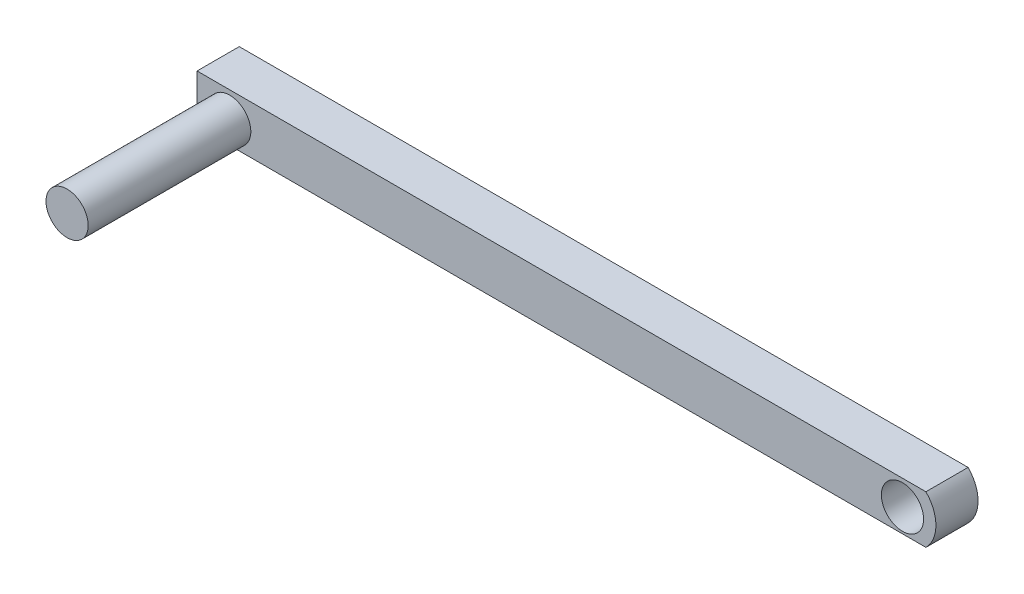
ISO-10303-21;
HEADER;
FILE_DESCRIPTION(('STEP AP214'),'2;1');
FILE_NAME('part.step','',(''),(''),'','','');
FILE_SCHEMA(('AUTOMOTIVE_DESIGN { 1 0 10303 214 1 1 1 1 }'));
ENDSEC;
DATA;
#1=APPLICATION_CONTEXT('core data for automotive mechanical design processes');
#2=APPLICATION_PROTOCOL_DEFINITION('international standard','automotive_design',2000,#1);
#3=PRODUCT_CONTEXT('',#1,'mechanical');
#4=PRODUCT('Part','Part','',(#3));
#5=PRODUCT_RELATED_PRODUCT_CATEGORY('part','',(#4));
#6=PRODUCT_DEFINITION_FORMATION('','',#4);
#7=PRODUCT_DEFINITION_CONTEXT('part definition',#1,'design');
#8=PRODUCT_DEFINITION('design','',#6,#7);
#9=PRODUCT_DEFINITION_SHAPE('','',#8);
#10=(LENGTH_UNIT() NAMED_UNIT(*) SI_UNIT(.MILLI.,.METRE.));
#11=(NAMED_UNIT(*) PLANE_ANGLE_UNIT() SI_UNIT($,.RADIAN.));
#12=(NAMED_UNIT(*) SI_UNIT($,.STERADIAN.) SOLID_ANGLE_UNIT());
#13=UNCERTAINTY_MEASURE_WITH_UNIT(LENGTH_MEASURE(1.E-05),#10,'distance_accuracy_value','');
#14=(GEOMETRIC_REPRESENTATION_CONTEXT(3) GLOBAL_UNCERTAINTY_ASSIGNED_CONTEXT((#13)) GLOBAL_UNIT_ASSIGNED_CONTEXT((#10,
#11,#12)) REPRESENTATION_CONTEXT('',''));
#15=CARTESIAN_POINT('',(0.,0.,0.));
#16=DIRECTION('',(0.,0.,1.));
#17=DIRECTION('',(1.,0.,0.));
#18=AXIS2_PLACEMENT_3D('',#15,#16,#17);
#19=CARTESIAN_POINT('',(-107.371794871795,35.7905982905983,14.));
#20=DIRECTION('',(1.,0.,0.));
#21=DIRECTION('',(0.,0.,-1.));
#22=AXIS2_PLACEMENT_3D('',#19,#20,#21);
#23=PLANE('',#22);
#24=DIRECTION('',(0.,-1.,0.));
#25=VECTOR('',#24,1.);
#26=CARTESIAN_POINT('',(-107.371794871795,35.7905982905983,0.));
#27=LINE('',#26,#25);
#28=CARTESIAN_POINT('',(-107.371794871795,35.7905982905983,0.));
#29=VERTEX_POINT('',#28);
#30=CARTESIAN_POINT('',(-107.371794871795,19.7905982905983,0.));
#31=VERTEX_POINT('',#30);
#32=EDGE_CURVE('E90',#29,#31,#27,.T.);
#33=ORIENTED_EDGE('',*,*,#32,.T.);
#34=DIRECTION('',(0.,0.,-1.));
#35=VECTOR('',#34,1.);
#36=CARTESIAN_POINT('',(-107.371794871795,19.7905982905983,14.));
#37=LINE('',#36,#35);
#38=CARTESIAN_POINT('',(-107.371794871795,19.7905982905983,14.));
#39=VERTEX_POINT('',#38);
#40=EDGE_CURVE('E11',#39,#31,#37,.T.);
#41=ORIENTED_EDGE('',*,*,#40,.F.);
#42=DIRECTION('',(0.,-1.,0.));
#43=VECTOR('',#42,1.);
#44=CARTESIAN_POINT('',(-107.371794871795,35.7905982905983,14.));
#45=LINE('',#44,#43);
#46=CARTESIAN_POINT('',(-107.371794871795,35.7905982905983,14.));
#47=VERTEX_POINT('',#46);
#48=EDGE_CURVE('E84',#47,#39,#45,.T.);
#49=ORIENTED_EDGE('',*,*,#48,.F.);
#50=DIRECTION('',(0.,0.,-1.));
#51=VECTOR('',#50,1.);
#52=CARTESIAN_POINT('',(-107.371794871795,35.7905982905983,14.));
#53=LINE('',#52,#51);
#54=EDGE_CURVE('E46',#47,#29,#53,.T.);
#55=ORIENTED_EDGE('',*,*,#54,.T.);
#56=EDGE_LOOP('',(#33,#41,#49,#55));
#57=FACE_BOUND('',#56,.T.);
#58=ADVANCED_FACE('F39',(#57),#23,.F.);
#59=CARTESIAN_POINT('',(-107.371794871795,19.7905982905983,14.));
#60=DIRECTION('',(0.,1.,0.));
#61=DIRECTION('',(0.,0.,1.));
#62=AXIS2_PLACEMENT_3D('',#59,#60,#61);
#63=PLANE('',#62);
#64=DIRECTION('',(1.,0.,0.));
#65=VECTOR('',#64,1.);
#66=CARTESIAN_POINT('',(-107.371794871795,19.7905982905983,0.));
#67=LINE('',#66,#65);
#68=CARTESIAN_POINT('',(134.612843431338,19.7905982905983,0.));
#69=VERTEX_POINT('',#68);
#70=EDGE_CURVE('E85',#31,#69,#67,.T.);
#71=ORIENTED_EDGE('',*,*,#70,.T.);
#72=DIRECTION('',(0.,0.,1.));
#73=VECTOR('',#72,1.);
#74=CARTESIAN_POINT('',(134.612843431338,19.7905982905983,0.));
#75=LINE('',#74,#73);
#76=CARTESIAN_POINT('',(134.612843431338,19.7905982905983,14.));
#77=VERTEX_POINT('',#76);
#78=EDGE_CURVE('E53',#69,#77,#75,.T.);
#79=ORIENTED_EDGE('',*,*,#78,.T.);
#80=DIRECTION('',(1.,0.,0.));
#81=VECTOR('',#80,1.);
#82=CARTESIAN_POINT('',(-107.371794871795,19.7905982905983,14.));
#83=LINE('',#82,#81);
#84=EDGE_CURVE('E101',#39,#77,#83,.T.);
#85=ORIENTED_EDGE('',*,*,#84,.F.);
#86=ORIENTED_EDGE('',*,*,#40,.T.);
#87=EDGE_LOOP('',(#71,#79,#85,#86));
#88=FACE_BOUND('',#87,.T.);
#89=ADVANCED_FACE('F136',(#88),#63,.F.);
#90=CARTESIAN_POINT('',(-107.371794871795,35.7905982905983,14.));
#91=DIRECTION('',(0.,-1.,0.));
#92=DIRECTION('',(0.,0.,-1.));
#93=AXIS2_PLACEMENT_3D('',#90,#91,#92);
#94=PLANE('',#93);
#95=DIRECTION('',(-1.,0.,0.));
#96=VECTOR('',#95,1.);
#97=CARTESIAN_POINT('',(-107.371794871795,35.7905982905983,14.));
#98=LINE('',#97,#96);
#99=CARTESIAN_POINT('',(134.612843431338,35.7905982905983,14.));
#100=VERTEX_POINT('',#99);
#101=EDGE_CURVE('E62',#100,#47,#98,.T.);
#102=ORIENTED_EDGE('',*,*,#101,.F.);
#103=DIRECTION('',(0.,0.,1.));
#104=VECTOR('',#103,1.);
#105=CARTESIAN_POINT('',(134.612843431338,35.7905982905983,0.));
#106=LINE('',#105,#104);
#107=CARTESIAN_POINT('',(134.612843431338,35.7905982905983,0.));
#108=VERTEX_POINT('',#107);
#109=EDGE_CURVE('E81',#108,#100,#106,.T.);
#110=ORIENTED_EDGE('',*,*,#109,.F.);
#111=DIRECTION('',(-1.,0.,0.));
#112=VECTOR('',#111,1.);
#113=CARTESIAN_POINT('',(-107.371794871795,35.7905982905983,0.));
#114=LINE('',#113,#112);
#115=EDGE_CURVE('E76',#108,#29,#114,.T.);
#116=ORIENTED_EDGE('',*,*,#115,.T.);
#117=ORIENTED_EDGE('',*,*,#54,.F.);
#118=EDGE_LOOP('',(#102,#110,#116,#117));
#119=FACE_BOUND('',#118,.T.);
#120=ADVANCED_FACE('F78',(#119),#94,.F.);
#121=CARTESIAN_POINT('',(0.,0.,14.));
#122=DIRECTION('',(0.,0.,1.));
#123=DIRECTION('',(1.,0.,0.));
#124=AXIS2_PLACEMENT_3D('',#121,#122,#123);
#125=PLANE('',#124);
#126=CARTESIAN_POINT('',(-96.5316607160045,27.2646163370496,14.));
#127=DIRECTION('',(0.,0.,1.));
#128=DIRECTION('',(1.,0.,0.));
#129=AXIS2_PLACEMENT_3D('',#126,#127,#128);
#130=CIRCLE('',#129,7.);
#131=CARTESIAN_POINT('',(-103.531660716005,27.2646163370496,14.));
#132=VERTEX_POINT('',#131);
#133=EDGE_CURVE('E112',#132,#132,#130,.T.);
#134=ORIENTED_EDGE('',*,*,#133,.F.);
#135=EDGE_LOOP('',(#134));
#136=FACE_BOUND('',#135,.T.);
#137=CARTESIAN_POINT('',(126.612843431335,27.7905982905983,14.));
#138=DIRECTION('',(0.,0.,-1.));
#139=DIRECTION('',(-1.,0.,0.));
#140=AXIS2_PLACEMENT_3D('',#137,#138,#139);
#141=CIRCLE('',#140,11.3137084989868);
#142=EDGE_CURVE('E110',#100,#77,#141,.T.);
#143=ORIENTED_EDGE('',*,*,#142,.F.);
#144=ORIENTED_EDGE('',*,*,#101,.T.);
#145=ORIENTED_EDGE('',*,*,#48,.T.);
#146=ORIENTED_EDGE('',*,*,#84,.T.);
#147=EDGE_LOOP('',(#143,#144,#145,#146));
#148=FACE_BOUND('',#147,.T.);
#149=CARTESIAN_POINT('',(126.832264355999,27.5188735360314,14.));
#150=DIRECTION('',(0.,0.,1.));
#151=DIRECTION('',(1.,0.,0.));
#152=AXIS2_PLACEMENT_3D('',#149,#150,#151);
#153=CIRCLE('',#152,7.00000000000001);
#154=CARTESIAN_POINT('',(133.832264355999,27.5188735360314,14.));
#155=VERTEX_POINT('',#154);
#156=EDGE_CURVE('E97',#155,#155,#153,.T.);
#157=ORIENTED_EDGE('',*,*,#156,.F.);
#158=EDGE_LOOP('',(#157));
#159=FACE_BOUND('',#158,.T.);
#160=ADVANCED_FACE('F145',(#136,#148,#159),#125,.T.);
#161=CARTESIAN_POINT('',(0.,0.,0.));
#162=DIRECTION('',(0.,0.,1.));
#163=DIRECTION('',(1.,0.,0.));
#164=AXIS2_PLACEMENT_3D('',#161,#162,#163);
#165=PLANE('',#164);
#166=CARTESIAN_POINT('',(126.832264355999,27.5188735360314,0.));
#167=DIRECTION('',(0.,0.,1.));
#168=DIRECTION('',(1.,0.,0.));
#169=AXIS2_PLACEMENT_3D('',#166,#167,#168);
#170=CIRCLE('',#169,7.00000000000001);
#171=CARTESIAN_POINT('',(133.832264355999,27.5188735360314,0.));
#172=VERTEX_POINT('',#171);
#173=EDGE_CURVE('E93',#172,#172,#170,.T.);
#174=ORIENTED_EDGE('',*,*,#173,.T.);
#175=EDGE_LOOP('',(#174));
#176=FACE_BOUND('',#175,.T.);
#177=ORIENTED_EDGE('',*,*,#115,.F.);
#178=CARTESIAN_POINT('',(126.612843431335,27.7905982905983,0.));
#179=DIRECTION('',(0.,0.,-1.));
#180=DIRECTION('',(-1.,0.,0.));
#181=AXIS2_PLACEMENT_3D('',#178,#179,#180);
#182=CIRCLE('',#181,11.3137084989868);
#183=EDGE_CURVE('E108',#108,#69,#182,.T.);
#184=ORIENTED_EDGE('',*,*,#183,.T.);
#185=ORIENTED_EDGE('',*,*,#70,.F.);
#186=ORIENTED_EDGE('',*,*,#32,.F.);
#187=EDGE_LOOP('',(#177,#184,#185,#186));
#188=FACE_BOUND('',#187,.T.);
#189=ADVANCED_FACE('F91',(#176,#188),#165,.F.);
#190=CARTESIAN_POINT('',(126.832264355999,27.5188735360314,0.));
#191=DIRECTION('',(0.,0.,1.));
#192=DIRECTION('',(1.,0.,0.));
#193=AXIS2_PLACEMENT_3D('',#190,#191,#192);
#194=CYLINDRICAL_SURFACE('',#193,7.00000000000001);
#195=CARTESIAN_POINT('',(133.832264355999,27.5188735360314,0.));
#196=CARTESIAN_POINT('',(133.832264355999,27.5188735360314,0.145833333333333));
#197=CARTESIAN_POINT('',(133.832264355999,27.5188735360314,0.291666666666667));
#198=CARTESIAN_POINT('',(133.832264355999,27.5188735360314,0.583333333333333));
#199=CARTESIAN_POINT('',(133.832264355999,27.5188735360314,0.729166666666667));
#200=CARTESIAN_POINT('',(133.832264355999,27.5188735360314,1.02083333333333));
#201=CARTESIAN_POINT('',(133.832264355999,27.5188735360314,1.16666666666667));
#202=CARTESIAN_POINT('',(133.832264355999,27.5188735360314,1.45833333333333));
#203=CARTESIAN_POINT('',(133.832264355999,27.5188735360314,1.60416666666667));
#204=CARTESIAN_POINT('',(133.832264355999,27.5188735360314,1.89583333333333));
#205=CARTESIAN_POINT('',(133.832264355999,27.5188735360314,2.04166666666667));
#206=CARTESIAN_POINT('',(133.832264355999,27.5188735360314,2.33333333333333));
#207=CARTESIAN_POINT('',(133.832264355999,27.5188735360314,2.47916666666667));
#208=CARTESIAN_POINT('',(133.832264355999,27.5188735360314,2.77083333333333));
#209=CARTESIAN_POINT('',(133.832264355999,27.5188735360314,2.91666666666667));
#210=CARTESIAN_POINT('',(133.832264355999,27.5188735360314,3.20833333333333));
#211=CARTESIAN_POINT('',(133.832264355999,27.5188735360314,3.35416666666667));
#212=CARTESIAN_POINT('',(133.832264355999,27.5188735360314,3.64583333333333));
#213=CARTESIAN_POINT('',(133.832264355999,27.5188735360314,3.79166666666667));
#214=CARTESIAN_POINT('',(133.832264355999,27.5188735360314,4.08333333333333));
#215=CARTESIAN_POINT('',(133.832264355999,27.5188735360314,4.22916666666667));
#216=CARTESIAN_POINT('',(133.832264355999,27.5188735360314,4.52083333333333));
#217=CARTESIAN_POINT('',(133.832264355999,27.5188735360314,4.66666666666667));
#218=CARTESIAN_POINT('',(133.832264355999,27.5188735360314,4.95833333333333));
#219=CARTESIAN_POINT('',(133.832264355999,27.5188735360314,5.10416666666667));
#220=CARTESIAN_POINT('',(133.832264355999,27.5188735360314,5.39583333333333));
#221=CARTESIAN_POINT('',(133.832264355999,27.5188735360314,5.54166666666667));
#222=CARTESIAN_POINT('',(133.832264355999,27.5188735360314,5.83333333333333));
#223=CARTESIAN_POINT('',(133.832264355999,27.5188735360314,5.97916666666667));
#224=CARTESIAN_POINT('',(133.832264355999,27.5188735360314,6.27083333333333));
#225=CARTESIAN_POINT('',(133.832264355999,27.5188735360314,6.41666666666667));
#226=CARTESIAN_POINT('',(133.832264355999,27.5188735360314,6.70833333333333));
#227=CARTESIAN_POINT('',(133.832264355999,27.5188735360314,6.85416666666666));
#228=CARTESIAN_POINT('',(133.832264355999,27.5188735360314,7.14583333333333));
#229=CARTESIAN_POINT('',(133.832264355999,27.5188735360314,7.29166666666667));
#230=CARTESIAN_POINT('',(133.832264355999,27.5188735360314,7.58333333333333));
#231=CARTESIAN_POINT('',(133.832264355999,27.5188735360314,7.72916666666667));
#232=CARTESIAN_POINT('',(133.832264355999,27.5188735360314,8.02083333333333));
#233=CARTESIAN_POINT('',(133.832264355999,27.5188735360314,8.16666666666666));
#234=CARTESIAN_POINT('',(133.832264355999,27.5188735360314,8.45833333333333));
#235=CARTESIAN_POINT('',(133.832264355999,27.5188735360314,8.60416666666666));
#236=CARTESIAN_POINT('',(133.832264355999,27.5188735360314,8.89583333333333));
#237=CARTESIAN_POINT('',(133.832264355999,27.5188735360314,9.04166666666666));
#238=CARTESIAN_POINT('',(133.832264355999,27.5188735360314,9.33333333333333));
#239=CARTESIAN_POINT('',(133.832264355999,27.5188735360314,9.47916666666666));
#240=CARTESIAN_POINT('',(133.832264355999,27.5188735360314,9.77083333333333));
#241=CARTESIAN_POINT('',(133.832264355999,27.5188735360314,9.91666666666666));
#242=CARTESIAN_POINT('',(133.832264355999,27.5188735360314,10.2083333333333));
#243=CARTESIAN_POINT('',(133.832264355999,27.5188735360314,10.3541666666667));
#244=CARTESIAN_POINT('',(133.832264355999,27.5188735360314,10.6458333333333));
#245=CARTESIAN_POINT('',(133.832264355999,27.5188735360314,10.7916666666667));
#246=CARTESIAN_POINT('',(133.832264355999,27.5188735360314,11.0833333333333));
#247=CARTESIAN_POINT('',(133.832264355999,27.5188735360314,11.2291666666667));
#248=CARTESIAN_POINT('',(133.832264355999,27.5188735360314,11.5208333333333));
#249=CARTESIAN_POINT('',(133.832264355999,27.5188735360314,11.6666666666667));
#250=CARTESIAN_POINT('',(133.832264355999,27.5188735360314,11.9583333333333));
#251=CARTESIAN_POINT('',(133.832264355999,27.5188735360314,12.1041666666667));
#252=CARTESIAN_POINT('',(133.832264355999,27.5188735360314,12.3958333333333));
#253=CARTESIAN_POINT('',(133.832264355999,27.5188735360314,12.5416666666667));
#254=CARTESIAN_POINT('',(133.832264355999,27.5188735360314,12.8333333333333));
#255=CARTESIAN_POINT('',(133.832264355999,27.5188735360314,12.9791666666667));
#256=CARTESIAN_POINT('',(133.832264355999,27.5188735360314,13.2708333333333));
#257=CARTESIAN_POINT('',(133.832264355999,27.5188735360314,13.4166666666667));
#258=CARTESIAN_POINT('',(133.832264355999,27.5188735360314,13.7083333333333));
#259=CARTESIAN_POINT('',(133.832264355999,27.5188735360314,13.8541666666667));
#260=CARTESIAN_POINT('',(133.832264355999,27.5188735360314,14.));
#261=B_SPLINE_CURVE_WITH_KNOTS('',3,(#195,#196,#197,#198,#199,#200,#201,#202,#203,#204,#205,
#206,#207,#208,#209,#210,#211,#212,#213,#214,#215,#216,#217,#218,#219,#220,#221,#222,#223,#224,
#225,#226,#227,#228,#229,#230,#231,#232,#233,#234,#235,#236,#237,#238,#239,#240,#241,#242,#243,
#244,#245,#246,#247,#248,#249,#250,#251,#252,#253,#254,#255,#256,#257,#258,#259,#260),
.UNSPECIFIED.,.F.,.F.,(4,2,2,2,2,2,2,2,2,2,2,2,2,2,2,2,2,2,2,2,2,2,2,2,2,2,2,2,2,2,2,2,4),(0.,
0.4375,0.875,1.3125,1.75,2.1875,2.625,3.0625,3.5,3.9375,4.375,4.8125,5.25,5.6875,6.125,6.5625,
7.,7.4375,7.875,8.3125,8.75,9.1875,9.625,10.0625,10.5,10.9375,11.375,11.8125,12.25,12.6875,
13.125,13.5625,14.),.UNSPECIFIED.);
#262=EDGE_CURVE('BSEAM133',#172,#155,#261,.T.);
#263=ORIENTED_EDGE('',*,*,#173,.F.);
#264=ORIENTED_EDGE('',*,*,#156,.T.);
#265=ORIENTED_EDGE('',*,*,#262,.T.);
#266=ORIENTED_EDGE('',*,*,#262,.F.);
#267=EDGE_LOOP('',(#263,#265,#264,#266));
#268=FACE_BOUND('',#267,.T.);
#269=ADVANCED_FACE('F133',(#268),#194,.F.);
#270=CARTESIAN_POINT('',(126.612843431335,27.7905982905983,0.));
#271=DIRECTION('',(0.,0.,1.));
#272=DIRECTION('',(1.,0.,0.));
#273=AXIS2_PLACEMENT_3D('',#270,#271,#272);
#274=CYLINDRICAL_SURFACE('',#273,11.3137084989868);
#275=ORIENTED_EDGE('',*,*,#142,.T.);
#276=ORIENTED_EDGE('',*,*,#78,.F.);
#277=ORIENTED_EDGE('',*,*,#183,.F.);
#278=ORIENTED_EDGE('',*,*,#109,.T.);
#279=EDGE_LOOP('',(#275,#276,#277,#278));
#280=FACE_BOUND('',#279,.T.);
#281=ADVANCED_FACE('F124',(#280),#274,.T.);
#282=CARTESIAN_POINT('',(-96.5316607160045,27.2646163370496,28.));
#283=DIRECTION('',(0.,0.,-1.));
#284=DIRECTION('',(-1.,0.,0.));
#285=AXIS2_PLACEMENT_3D('',#282,#283,#284);
#286=CYLINDRICAL_SURFACE('',#285,7.);
#287=CARTESIAN_POINT('',(-96.5316607160045,27.2646163370496,68.));
#288=DIRECTION('',(0.,0.,1.));
#289=DIRECTION('',(1.,0.,0.));
#290=AXIS2_PLACEMENT_3D('',#287,#288,#289);
#291=CIRCLE('',#290,7.);
#292=CARTESIAN_POINT('',(-103.531660716005,27.2646163370496,68.));
#293=VERTEX_POINT('',#292);
#294=EDGE_CURVE('E116',#293,#293,#291,.T.);
#295=CARTESIAN_POINT('',(-103.531660716005,27.2646163370496,14.));
#296=CARTESIAN_POINT('',(-103.531660716005,27.2646163370496,14.5625));
#297=CARTESIAN_POINT('',(-103.531660716005,27.2646163370496,15.125));
#298=CARTESIAN_POINT('',(-103.531660716005,27.2646163370496,16.25));
#299=CARTESIAN_POINT('',(-103.531660716005,27.2646163370496,16.8125));
#300=CARTESIAN_POINT('',(-103.531660716005,27.2646163370496,17.9375));
#301=CARTESIAN_POINT('',(-103.531660716005,27.2646163370496,18.5));
#302=CARTESIAN_POINT('',(-103.531660716005,27.2646163370496,19.625));
#303=CARTESIAN_POINT('',(-103.531660716005,27.2646163370496,20.1875));
#304=CARTESIAN_POINT('',(-103.531660716005,27.2646163370496,21.3125));
#305=CARTESIAN_POINT('',(-103.531660716005,27.2646163370496,21.875));
#306=CARTESIAN_POINT('',(-103.531660716005,27.2646163370496,23.));
#307=CARTESIAN_POINT('',(-103.531660716005,27.2646163370496,23.5625));
#308=CARTESIAN_POINT('',(-103.531660716005,27.2646163370496,24.6875));
#309=CARTESIAN_POINT('',(-103.531660716005,27.2646163370496,25.25));
#310=CARTESIAN_POINT('',(-103.531660716005,27.2646163370496,26.375));
#311=CARTESIAN_POINT('',(-103.531660716005,27.2646163370496,26.9375));
#312=CARTESIAN_POINT('',(-103.531660716005,27.2646163370496,28.0625));
#313=CARTESIAN_POINT('',(-103.531660716005,27.2646163370496,28.625));
#314=CARTESIAN_POINT('',(-103.531660716005,27.2646163370496,29.75));
#315=CARTESIAN_POINT('',(-103.531660716005,27.2646163370496,30.3125));
#316=CARTESIAN_POINT('',(-103.531660716005,27.2646163370496,31.4375));
#317=CARTESIAN_POINT('',(-103.531660716005,27.2646163370496,32.));
#318=CARTESIAN_POINT('',(-103.531660716005,27.2646163370496,33.125));
#319=CARTESIAN_POINT('',(-103.531660716005,27.2646163370496,33.6875));
#320=CARTESIAN_POINT('',(-103.531660716005,27.2646163370496,34.8125));
#321=CARTESIAN_POINT('',(-103.531660716005,27.2646163370496,35.375));
#322=CARTESIAN_POINT('',(-103.531660716005,27.2646163370496,36.5));
#323=CARTESIAN_POINT('',(-103.531660716005,27.2646163370496,37.0625));
#324=CARTESIAN_POINT('',(-103.531660716005,27.2646163370496,38.1875));
#325=CARTESIAN_POINT('',(-103.531660716005,27.2646163370496,38.75));
#326=CARTESIAN_POINT('',(-103.531660716005,27.2646163370496,39.875));
#327=CARTESIAN_POINT('',(-103.531660716005,27.2646163370496,40.4375));
#328=CARTESIAN_POINT('',(-103.531660716005,27.2646163370496,41.5625));
#329=CARTESIAN_POINT('',(-103.531660716005,27.2646163370496,42.125));
#330=CARTESIAN_POINT('',(-103.531660716005,27.2646163370496,43.25));
#331=CARTESIAN_POINT('',(-103.531660716005,27.2646163370496,43.8125));
#332=CARTESIAN_POINT('',(-103.531660716005,27.2646163370496,44.9375));
#333=CARTESIAN_POINT('',(-103.531660716005,27.2646163370496,45.5));
#334=CARTESIAN_POINT('',(-103.531660716005,27.2646163370496,46.625));
#335=CARTESIAN_POINT('',(-103.531660716005,27.2646163370496,47.1875));
#336=CARTESIAN_POINT('',(-103.531660716005,27.2646163370496,48.3125));
#337=CARTESIAN_POINT('',(-103.531660716005,27.2646163370496,48.875));
#338=CARTESIAN_POINT('',(-103.531660716005,27.2646163370496,50.));
#339=CARTESIAN_POINT('',(-103.531660716005,27.2646163370496,50.5625));
#340=CARTESIAN_POINT('',(-103.531660716005,27.2646163370496,51.6875));
#341=CARTESIAN_POINT('',(-103.531660716005,27.2646163370496,52.25));
#342=CARTESIAN_POINT('',(-103.531660716005,27.2646163370496,53.375));
#343=CARTESIAN_POINT('',(-103.531660716005,27.2646163370496,53.9375));
#344=CARTESIAN_POINT('',(-103.531660716005,27.2646163370496,55.0625));
#345=CARTESIAN_POINT('',(-103.531660716005,27.2646163370496,55.625));
#346=CARTESIAN_POINT('',(-103.531660716005,27.2646163370496,56.75));
#347=CARTESIAN_POINT('',(-103.531660716005,27.2646163370496,57.3125));
#348=CARTESIAN_POINT('',(-103.531660716005,27.2646163370496,58.4375));
#349=CARTESIAN_POINT('',(-103.531660716005,27.2646163370496,59.));
#350=CARTESIAN_POINT('',(-103.531660716005,27.2646163370496,60.125));
#351=CARTESIAN_POINT('',(-103.531660716005,27.2646163370496,60.6875));
#352=CARTESIAN_POINT('',(-103.531660716005,27.2646163370496,61.8125));
#353=CARTESIAN_POINT('',(-103.531660716005,27.2646163370496,62.375));
#354=CARTESIAN_POINT('',(-103.531660716005,27.2646163370496,63.5));
#355=CARTESIAN_POINT('',(-103.531660716005,27.2646163370496,64.0625));
#356=CARTESIAN_POINT('',(-103.531660716005,27.2646163370496,65.1875));
#357=CARTESIAN_POINT('',(-103.531660716005,27.2646163370496,65.75));
#358=CARTESIAN_POINT('',(-103.531660716005,27.2646163370496,66.875));
#359=CARTESIAN_POINT('',(-103.531660716005,27.2646163370496,67.4375));
#360=CARTESIAN_POINT('',(-103.531660716005,27.2646163370496,68.));
#361=B_SPLINE_CURVE_WITH_KNOTS('',3,(#295,#296,#297,#298,#299,#300,#301,#302,#303,#304,#305,
#306,#307,#308,#309,#310,#311,#312,#313,#314,#315,#316,#317,#318,#319,#320,#321,#322,#323,#324,
#325,#326,#327,#328,#329,#330,#331,#332,#333,#334,#335,#336,#337,#338,#339,#340,#341,#342,#343,
#344,#345,#346,#347,#348,#349,#350,#351,#352,#353,#354,#355,#356,#357,#358,#359,#360),
.UNSPECIFIED.,.F.,.F.,(4,2,2,2,2,2,2,2,2,2,2,2,2,2,2,2,2,2,2,2,2,2,2,2,2,2,2,2,2,2,2,2,4),(0.,
1.6875,3.375,5.0625,6.75,8.4375,10.125,11.8125,13.5,15.1875,16.875,18.5625,20.25,21.9375,23.625,
25.3125,27.,28.6875,30.375,32.0625,33.75,35.4375,37.125,38.8125,40.5,42.1875,43.875,45.5625,
47.25,48.9375,50.625,52.3125,54.),.UNSPECIFIED.);
#362=EDGE_CURVE('BSEAM122',#132,#293,#361,.T.);
#363=ORIENTED_EDGE('',*,*,#133,.T.);
#364=ORIENTED_EDGE('',*,*,#294,.F.);
#365=ORIENTED_EDGE('',*,*,#362,.T.);
#366=ORIENTED_EDGE('',*,*,#362,.F.);
#367=EDGE_LOOP('',(#363,#365,#364,#366));
#368=FACE_BOUND('',#367,.T.);
#369=ADVANCED_FACE('F122',(#368),#286,.T.);
#370=CARTESIAN_POINT('',(-96.5316607160045,27.2646163370496,68.));
#371=DIRECTION('',(0.,0.,1.));
#372=DIRECTION('',(1.,0.,0.));
#373=AXIS2_PLACEMENT_3D('',#370,#371,#372);
#374=PLANE('',#373);
#375=ORIENTED_EDGE('',*,*,#294,.T.);
#376=EDGE_LOOP('',(#375));
#377=FACE_BOUND('',#376,.T.);
#378=ADVANCED_FACE('F120',(#377),#374,.T.);
#379=CLOSED_SHELL('',(#58,#89,#120,#160,#189,#269,#281,#369,#378));
#380=MANIFOLD_SOLID_BREP('B2',#379);
#381=ADVANCED_BREP_SHAPE_REPRESENTATION('',(#18,#380),#14);
#382=SHAPE_DEFINITION_REPRESENTATION(#9,#381);
ENDSEC;
END-ISO-10303-21;
